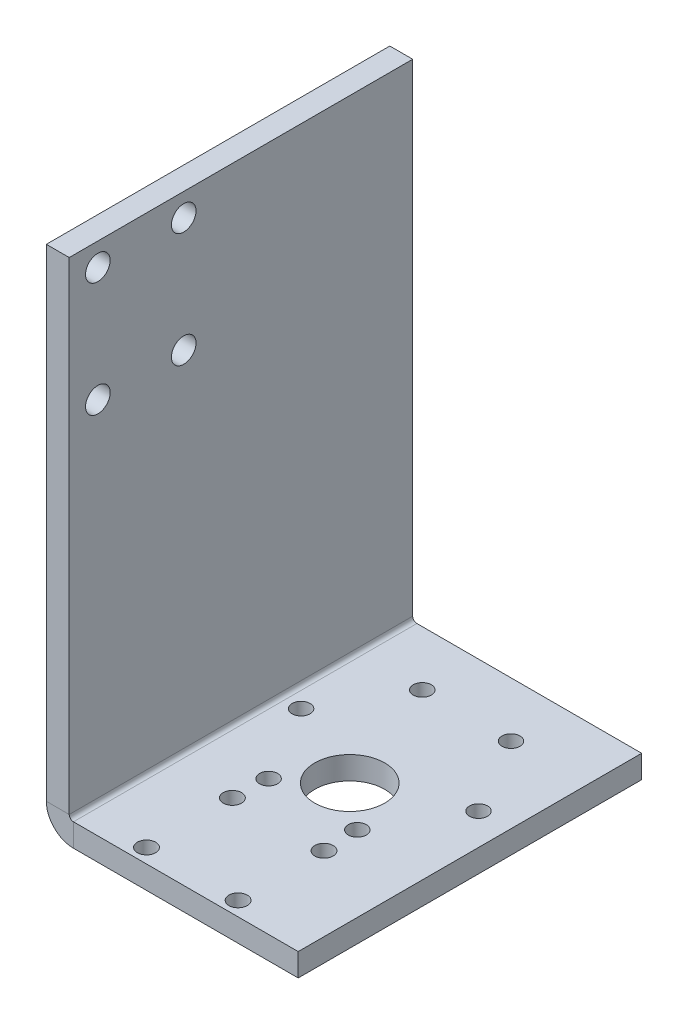
ISO-10303-21;
HEADER;
FILE_DESCRIPTION(('STEP AP214'),'2;1');
FILE_NAME('part.step','',(''),(''),'','','');
FILE_SCHEMA(('AUTOMOTIVE_DESIGN { 1 0 10303 214 1 1 1 1 }'));
ENDSEC;
DATA;
#1=APPLICATION_CONTEXT('core data for automotive mechanical design processes');
#2=APPLICATION_PROTOCOL_DEFINITION('international standard','automotive_design',2000,#1);
#3=PRODUCT_CONTEXT('',#1,'mechanical');
#4=PRODUCT('Part','Part','',(#3));
#5=PRODUCT_RELATED_PRODUCT_CATEGORY('part','',(#4));
#6=PRODUCT_DEFINITION_FORMATION('','',#4);
#7=PRODUCT_DEFINITION_CONTEXT('part definition',#1,'design');
#8=PRODUCT_DEFINITION('design','',#6,#7);
#9=PRODUCT_DEFINITION_SHAPE('','',#8);
#10=(LENGTH_UNIT() NAMED_UNIT(*) SI_UNIT(.MILLI.,.METRE.));
#11=(NAMED_UNIT(*) PLANE_ANGLE_UNIT() SI_UNIT($,.RADIAN.));
#12=(NAMED_UNIT(*) SI_UNIT($,.STERADIAN.) SOLID_ANGLE_UNIT());
#13=UNCERTAINTY_MEASURE_WITH_UNIT(LENGTH_MEASURE(1.E-05),#10,'distance_accuracy_value','');
#14=(GEOMETRIC_REPRESENTATION_CONTEXT(3) GLOBAL_UNCERTAINTY_ASSIGNED_CONTEXT((#13)) GLOBAL_UNIT_ASSIGNED_CONTEXT((#10,
#11,#12)) REPRESENTATION_CONTEXT('',''));
#15=CARTESIAN_POINT('',(0.,0.,0.));
#16=DIRECTION('',(0.,0.,1.));
#17=DIRECTION('',(1.,0.,0.));
#18=AXIS2_PLACEMENT_3D('',#15,#16,#17);
#19=CARTESIAN_POINT('',(0.7366,0.,30.));
#20=DIRECTION('',(0.,0.,1.));
#21=DIRECTION('',(1.,0.,0.));
#22=AXIS2_PLACEMENT_3D('',#19,#20,#21);
#23=PLANE('',#22);
#24=DIRECTION('',(0.,-1.,0.));
#25=VECTOR('',#24,1.);
#26=CARTESIAN_POINT('',(0.7366,0.,30.));
#27=LINE('',#26,#25);
#28=CARTESIAN_POINT('',(0.7366,0.,30.));
#29=VERTEX_POINT('',#28);
#30=CARTESIAN_POINT('',(0.7366,-4.,30.));
#31=VERTEX_POINT('',#30);
#32=EDGE_CURVE('E11',#29,#31,#27,.T.);
#33=ORIENTED_EDGE('',*,*,#32,.F.);
#34=CARTESIAN_POINT('',(0.7366,0.7366,30.));
#35=DIRECTION('',(0.,0.,-1.));
#36=DIRECTION('',(-1.,0.,0.));
#37=AXIS2_PLACEMENT_3D('',#34,#35,#36);
#38=CIRCLE('',#37,0.7366);
#39=CARTESIAN_POINT('',(0.,0.7366,30.));
#40=VERTEX_POINT('',#39);
#41=EDGE_CURVE('E138',#40,#29,#38,.F.);
#42=ORIENTED_EDGE('',*,*,#41,.F.);
#43=DIRECTION('',(1.,0.,0.));
#44=VECTOR('',#43,1.);
#45=CARTESIAN_POINT('',(-4.,0.736600000000001,30.));
#46=LINE('',#45,#44);
#47=CARTESIAN_POINT('',(-4.,0.736600000000001,30.));
#48=VERTEX_POINT('',#47);
#49=EDGE_CURVE('E48',#48,#40,#46,.T.);
#50=ORIENTED_EDGE('',*,*,#49,.F.);
#51=CARTESIAN_POINT('',(0.7366,0.7366,30.));
#52=DIRECTION('',(0.,0.,1.));
#53=DIRECTION('',(1.,0.,0.));
#54=AXIS2_PLACEMENT_3D('',#51,#52,#53);
#55=CIRCLE('',#54,4.7366);
#56=EDGE_CURVE('E131',#48,#31,#55,.T.);
#57=ORIENTED_EDGE('',*,*,#56,.T.);
#58=EDGE_LOOP('',(#33,#42,#50,#57));
#59=FACE_BOUND('',#58,.T.);
#60=ADVANCED_FACE('F39',(#59),#23,.T.);
#61=CARTESIAN_POINT('',(-4.,0.736600000000001,30.));
#62=DIRECTION('',(0.,0.,1.));
#63=DIRECTION('',(1.,0.,0.));
#64=AXIS2_PLACEMENT_3D('',#61,#62,#63);
#65=PLANE('',#64);
#66=DIRECTION('',(1.,0.,0.));
#67=VECTOR('',#66,1.);
#68=CARTESIAN_POINT('',(0.,0.,30.));
#69=LINE('',#68,#67);
#70=CARTESIAN_POINT('',(40.,0.,30.));
#71=VERTEX_POINT('',#70);
#72=EDGE_CURVE('E273',#29,#71,#69,.T.);
#73=ORIENTED_EDGE('',*,*,#72,.F.);
#74=ORIENTED_EDGE('',*,*,#32,.T.);
#75=DIRECTION('',(1.,0.,0.));
#76=VECTOR('',#75,1.);
#77=CARTESIAN_POINT('',(0.,-4.,30.));
#78=LINE('',#77,#76);
#79=CARTESIAN_POINT('',(40.,-4.,30.));
#80=VERTEX_POINT('',#79);
#81=EDGE_CURVE('E97',#31,#80,#78,.T.);
#82=ORIENTED_EDGE('',*,*,#81,.T.);
#83=DIRECTION('',(0.,-1.,0.));
#84=VECTOR('',#83,1.);
#85=CARTESIAN_POINT('',(40.,0.,30.));
#86=LINE('',#85,#84);
#87=EDGE_CURVE('E270',#71,#80,#86,.T.);
#88=ORIENTED_EDGE('',*,*,#87,.F.);
#89=EDGE_LOOP('',(#73,#74,#82,#88));
#90=FACE_BOUND('',#89,.T.);
#91=ADVANCED_FACE('F293',(#90),#65,.T.);
#92=CARTESIAN_POINT('',(0.,0.7366,-30.));
#93=DIRECTION('',(0.,0.,-1.));
#94=DIRECTION('',(-1.,0.,0.));
#95=AXIS2_PLACEMENT_3D('',#92,#93,#94);
#96=PLANE('',#95);
#97=DIRECTION('',(-1.,0.,0.));
#98=VECTOR('',#97,1.);
#99=CARTESIAN_POINT('',(0.,0.7366,-30.));
#100=LINE('',#99,#98);
#101=CARTESIAN_POINT('',(0.,0.7366,-30.));
#102=VERTEX_POINT('',#101);
#103=CARTESIAN_POINT('',(-4.,0.736600000000001,-30.));
#104=VERTEX_POINT('',#103);
#105=EDGE_CURVE('E84',#102,#104,#100,.T.);
#106=ORIENTED_EDGE('',*,*,#105,.F.);
#107=CARTESIAN_POINT('',(0.7366,0.7366,-30.));
#108=DIRECTION('',(0.,0.,-1.));
#109=DIRECTION('',(-1.,0.,0.));
#110=AXIS2_PLACEMENT_3D('',#107,#108,#109);
#111=CIRCLE('',#110,0.7366);
#112=CARTESIAN_POINT('',(0.7366,0.,-30.));
#113=VERTEX_POINT('',#112);
#114=EDGE_CURVE('E154',#102,#113,#111,.F.);
#115=ORIENTED_EDGE('',*,*,#114,.T.);
#116=DIRECTION('',(0.,1.,0.));
#117=VECTOR('',#116,1.);
#118=CARTESIAN_POINT('',(0.7366,-4.,-30.));
#119=LINE('',#118,#117);
#120=CARTESIAN_POINT('',(0.7366,-4.,-30.));
#121=VERTEX_POINT('',#120);
#122=EDGE_CURVE('E91',#121,#113,#119,.T.);
#123=ORIENTED_EDGE('',*,*,#122,.F.);
#124=CARTESIAN_POINT('',(0.7366,0.7366,-30.));
#125=DIRECTION('',(0.,0.,1.));
#126=DIRECTION('',(1.,0.,0.));
#127=AXIS2_PLACEMENT_3D('',#124,#125,#126);
#128=CIRCLE('',#127,4.7366);
#129=EDGE_CURVE('E161',#104,#121,#128,.T.);
#130=ORIENTED_EDGE('',*,*,#129,.F.);
#131=EDGE_LOOP('',(#106,#115,#123,#130));
#132=FACE_BOUND('',#131,.T.);
#133=ADVANCED_FACE('F291',(#132),#96,.T.);
#134=CARTESIAN_POINT('',(0.7366,-4.,-30.));
#135=DIRECTION('',(0.,0.,-1.));
#136=DIRECTION('',(-1.,0.,0.));
#137=AXIS2_PLACEMENT_3D('',#134,#135,#136);
#138=PLANE('',#137);
#139=DIRECTION('',(0.,-1.,0.));
#140=VECTOR('',#139,1.);
#141=CARTESIAN_POINT('',(0.,0.,-30.));
#142=LINE('',#141,#140);
#143=CARTESIAN_POINT('',(0.,85.,-30.));
#144=VERTEX_POINT('',#143);
#145=EDGE_CURVE('E156',#144,#102,#142,.T.);
#146=ORIENTED_EDGE('',*,*,#145,.T.);
#147=ORIENTED_EDGE('',*,*,#105,.T.);
#148=DIRECTION('',(0.,1.,0.));
#149=VECTOR('',#148,1.);
#150=CARTESIAN_POINT('',(-4.,0.,-30.));
#151=LINE('',#150,#149);
#152=CARTESIAN_POINT('',(-4.,85.,-30.));
#153=VERTEX_POINT('',#152);
#154=EDGE_CURVE('E159',#153,#104,#151,.F.);
#155=ORIENTED_EDGE('',*,*,#154,.F.);
#156=DIRECTION('',(1.,0.,0.));
#157=VECTOR('',#156,1.);
#158=CARTESIAN_POINT('',(-4.,85.,-30.));
#159=LINE('',#158,#157);
#160=EDGE_CURVE('E119',#153,#144,#159,.T.);
#161=ORIENTED_EDGE('',*,*,#160,.T.);
#162=EDGE_LOOP('',(#146,#147,#155,#161));
#163=FACE_BOUND('',#162,.T.);
#164=ADVANCED_FACE('F287',(#163),#138,.T.);
#165=CARTESIAN_POINT('',(0.,-4.,30.));
#166=DIRECTION('',(0.,1.,0.));
#167=DIRECTION('',(0.,0.,1.));
#168=AXIS2_PLACEMENT_3D('',#165,#166,#167);
#169=PLANE('',#168);
#170=CARTESIAN_POINT('',(34.5,-4.,-7.));
#171=DIRECTION('',(0.,-1.,0.));
#172=DIRECTION('',(0.,0.,-1.));
#173=AXIS2_PLACEMENT_3D('',#170,#171,#172);
#174=CIRCLE('',#173,1.57499999999999);
#175=CARTESIAN_POINT('',(34.5,-4.,-8.57499999999999));
#176=VERTEX_POINT('',#175);
#177=EDGE_CURVE('E209',#176,#176,#174,.T.);
#178=ORIENTED_EDGE('',*,*,#177,.F.);
#179=EDGE_LOOP('',(#178));
#180=FACE_BOUND('',#179,.T.);
#181=CARTESIAN_POINT('',(3.5,-4.,-7.));
#182=DIRECTION('',(0.,-1.,0.));
#183=DIRECTION('',(0.,0.,-1.));
#184=AXIS2_PLACEMENT_3D('',#181,#182,#183);
#185=CIRCLE('',#184,1.57499999999999);
#186=CARTESIAN_POINT('',(3.5,-4.,-8.57499999999999));
#187=VERTEX_POINT('',#186);
#188=EDGE_CURVE('E199',#187,#187,#185,.T.);
#189=ORIENTED_EDGE('',*,*,#188,.F.);
#190=EDGE_LOOP('',(#189));
#191=FACE_BOUND('',#190,.T.);
#192=CARTESIAN_POINT('',(11.25,-4.,6.42339375865881));
#193=DIRECTION('',(0.,-1.,0.));
#194=DIRECTION('',(0.,0.,-1.));
#195=AXIS2_PLACEMENT_3D('',#192,#193,#194);
#196=CIRCLE('',#195,1.57499999999999);
#197=CARTESIAN_POINT('',(11.25,-4.,4.84839375865882));
#198=VERTEX_POINT('',#197);
#199=EDGE_CURVE('E196',#198,#198,#196,.T.);
#200=ORIENTED_EDGE('',*,*,#199,.F.);
#201=EDGE_LOOP('',(#200));
#202=FACE_BOUND('',#201,.T.);
#203=CARTESIAN_POINT('',(11.2499999999999,-4.,-20.4233937586588));
#204=DIRECTION('',(0.,-1.,0.));
#205=DIRECTION('',(0.,0.,-1.));
#206=AXIS2_PLACEMENT_3D('',#203,#204,#205);
#207=CIRCLE('',#206,1.57499999999999);
#208=CARTESIAN_POINT('',(11.2499999999999,-4.,-21.9983937586588));
#209=VERTEX_POINT('',#208);
#210=EDGE_CURVE('E193',#209,#209,#207,.T.);
#211=ORIENTED_EDGE('',*,*,#210,.F.);
#212=EDGE_LOOP('',(#211));
#213=FACE_BOUND('',#212,.T.);
#214=CARTESIAN_POINT('',(26.75,-4.,-20.4233937586588));
#215=DIRECTION('',(0.,-1.,0.));
#216=DIRECTION('',(0.,0.,-1.));
#217=AXIS2_PLACEMENT_3D('',#214,#215,#216);
#218=CIRCLE('',#217,1.57499999999999);
#219=CARTESIAN_POINT('',(26.75,-4.,-21.9983937586588));
#220=VERTEX_POINT('',#219);
#221=EDGE_CURVE('E189',#220,#220,#218,.T.);
#222=ORIENTED_EDGE('',*,*,#221,.F.);
#223=EDGE_LOOP('',(#222));
#224=FACE_BOUND('',#223,.T.);
#225=CARTESIAN_POINT('',(26.7500000000001,-4.,6.42339375865876));
#226=DIRECTION('',(0.,-1.,0.));
#227=DIRECTION('',(0.,0.,-1.));
#228=AXIS2_PLACEMENT_3D('',#225,#226,#227);
#229=CIRCLE('',#228,1.57499999999999);
#230=CARTESIAN_POINT('',(26.7500000000001,-4.,4.84839375865877));
#231=VERTEX_POINT('',#230);
#232=EDGE_CURVE('E188',#231,#231,#229,.T.);
#233=ORIENTED_EDGE('',*,*,#232,.F.);
#234=EDGE_LOOP('',(#233));
#235=FACE_BOUND('',#234,.T.);
#236=CARTESIAN_POINT('',(19.,-4.,0.));
#237=DIRECTION('',(0.,-1.,0.));
#238=DIRECTION('',(0.,0.,-1.));
#239=AXIS2_PLACEMENT_3D('',#236,#237,#238);
#240=CIRCLE('',#239,6.10000000000001);
#241=CARTESIAN_POINT('',(19.,-4.,-6.10000000000001));
#242=VERTEX_POINT('',#241);
#243=EDGE_CURVE('E184',#242,#242,#240,.T.);
#244=ORIENTED_EDGE('',*,*,#243,.F.);
#245=EDGE_LOOP('',(#244));
#246=FACE_BOUND('',#245,.T.);
#247=CARTESIAN_POINT('',(27.,-4.,27.5));
#248=DIRECTION('',(0.,1.,0.));
#249=DIRECTION('',(0.,0.,1.));
#250=AXIS2_PLACEMENT_3D('',#247,#248,#249);
#251=CIRCLE('',#250,1.59999999999999);
#252=CARTESIAN_POINT('',(27.,-4.,29.1));
#253=VERTEX_POINT('',#252);
#254=EDGE_CURVE('E249',#253,#253,#251,.T.);
#255=ORIENTED_EDGE('',*,*,#254,.T.);
#256=EDGE_LOOP('',(#255));
#257=FACE_BOUND('',#256,.T.);
#258=CARTESIAN_POINT('',(11.,-4.,12.5));
#259=DIRECTION('',(0.,1.,0.));
#260=DIRECTION('',(0.,0.,1.));
#261=AXIS2_PLACEMENT_3D('',#258,#259,#260);
#262=CIRCLE('',#261,1.59999999999999);
#263=CARTESIAN_POINT('',(11.,-4.,14.1));
#264=VERTEX_POINT('',#263);
#265=EDGE_CURVE('E255',#264,#264,#262,.T.);
#266=ORIENTED_EDGE('',*,*,#265,.T.);
#267=EDGE_LOOP('',(#266));
#268=FACE_BOUND('',#267,.T.);
#269=CARTESIAN_POINT('',(11.,-4.,27.5));
#270=DIRECTION('',(0.,1.,0.));
#271=DIRECTION('',(0.,0.,1.));
#272=AXIS2_PLACEMENT_3D('',#269,#270,#271);
#273=CIRCLE('',#272,1.59999999999999);
#274=CARTESIAN_POINT('',(11.,-4.,29.1));
#275=VERTEX_POINT('',#274);
#276=EDGE_CURVE('E261',#275,#275,#273,.T.);
#277=ORIENTED_EDGE('',*,*,#276,.T.);
#278=EDGE_LOOP('',(#277));
#279=FACE_BOUND('',#278,.T.);
#280=CARTESIAN_POINT('',(27.,-4.,12.5));
#281=DIRECTION('',(0.,1.,0.));
#282=DIRECTION('',(0.,0.,1.));
#283=AXIS2_PLACEMENT_3D('',#280,#281,#282);
#284=CIRCLE('',#283,1.59999999999999);
#285=CARTESIAN_POINT('',(27.,-4.,14.1));
#286=VERTEX_POINT('',#285);
#287=EDGE_CURVE('E148',#286,#286,#284,.T.);
#288=ORIENTED_EDGE('',*,*,#287,.T.);
#289=EDGE_LOOP('',(#288));
#290=FACE_BOUND('',#289,.T.);
#291=DIRECTION('',(1.,0.,0.));
#292=VECTOR('',#291,1.);
#293=CARTESIAN_POINT('',(0.,-4.,-30.));
#294=LINE('',#293,#292);
#295=CARTESIAN_POINT('',(40.,-4.,-30.));
#296=VERTEX_POINT('',#295);
#297=EDGE_CURVE('E144',#121,#296,#294,.T.);
#298=ORIENTED_EDGE('',*,*,#297,.T.);
#299=DIRECTION('',(0.,0.,-1.));
#300=VECTOR('',#299,1.);
#301=CARTESIAN_POINT('',(40.,-4.,30.));
#302=LINE('',#301,#300);
#303=EDGE_CURVE('E175',#80,#296,#302,.T.);
#304=ORIENTED_EDGE('',*,*,#303,.F.);
#305=ORIENTED_EDGE('',*,*,#81,.F.);
#306=DIRECTION('',(0.,0.,-1.));
#307=VECTOR('',#306,1.);
#308=CARTESIAN_POINT('',(0.7366,-4.,30.));
#309=LINE('',#308,#307);
#310=EDGE_CURVE('E143',#31,#121,#309,.T.);
#311=ORIENTED_EDGE('',*,*,#310,.T.);
#312=EDGE_LOOP('',(#298,#304,#305,#311));
#313=FACE_BOUND('',#312,.T.);
#314=ADVANCED_FACE('F299',(#180,#191,#202,#213,#224,#235,#246,#257,#268,#279,#290,#313),#169,.F.);
#315=CARTESIAN_POINT('',(40.,0.,30.));
#316=DIRECTION('',(1.,0.,0.));
#317=DIRECTION('',(0.,0.,-1.));
#318=AXIS2_PLACEMENT_3D('',#315,#316,#317);
#319=PLANE('',#318);
#320=DIRECTION('',(0.,-1.,0.));
#321=VECTOR('',#320,1.);
#322=CARTESIAN_POINT('',(40.,0.,-30.));
#323=LINE('',#322,#321);
#324=CARTESIAN_POINT('',(40.,0.,-30.));
#325=VERTEX_POINT('',#324);
#326=EDGE_CURVE('E147',#325,#296,#323,.T.);
#327=ORIENTED_EDGE('',*,*,#326,.F.);
#328=DIRECTION('',(0.,0.,-1.));
#329=VECTOR('',#328,1.);
#330=CARTESIAN_POINT('',(40.,0.,30.));
#331=LINE('',#330,#329);
#332=EDGE_CURVE('E173',#71,#325,#331,.T.);
#333=ORIENTED_EDGE('',*,*,#332,.F.);
#334=ORIENTED_EDGE('',*,*,#87,.T.);
#335=ORIENTED_EDGE('',*,*,#303,.T.);
#336=EDGE_LOOP('',(#327,#333,#334,#335));
#337=FACE_BOUND('',#336,.T.);
#338=ADVANCED_FACE('F328',(#337),#319,.T.);
#339=CARTESIAN_POINT('',(0.,0.,30.));
#340=DIRECTION('',(0.,1.,0.));
#341=DIRECTION('',(0.,0.,1.));
#342=AXIS2_PLACEMENT_3D('',#339,#340,#341);
#343=PLANE('',#342);
#344=CARTESIAN_POINT('',(34.5,0.,-7.));
#345=DIRECTION('',(0.,1.,0.));
#346=DIRECTION('',(0.,0.,1.));
#347=AXIS2_PLACEMENT_3D('',#344,#345,#346);
#348=CIRCLE('',#347,1.57499999999999);
#349=CARTESIAN_POINT('',(34.5,0.,-5.42500000000001));
#350=VERTEX_POINT('',#349);
#351=EDGE_CURVE('E42',#350,#350,#348,.T.);
#352=ORIENTED_EDGE('',*,*,#351,.F.);
#353=EDGE_LOOP('',(#352));
#354=FACE_BOUND('',#353,.T.);
#355=CARTESIAN_POINT('',(3.5,0.,-7.));
#356=DIRECTION('',(0.,1.,0.));
#357=DIRECTION('',(0.,0.,1.));
#358=AXIS2_PLACEMENT_3D('',#355,#356,#357);
#359=CIRCLE('',#358,1.57499999999999);
#360=CARTESIAN_POINT('',(3.5,0.,-5.42500000000001));
#361=VERTEX_POINT('',#360);
#362=EDGE_CURVE('E197',#361,#361,#359,.T.);
#363=ORIENTED_EDGE('',*,*,#362,.F.);
#364=EDGE_LOOP('',(#363));
#365=FACE_BOUND('',#364,.T.);
#366=CARTESIAN_POINT('',(11.25,0.,6.42339375865881));
#367=DIRECTION('',(0.,1.,0.));
#368=DIRECTION('',(0.,0.,1.));
#369=AXIS2_PLACEMENT_3D('',#366,#367,#368);
#370=CIRCLE('',#369,1.57499999999999);
#371=CARTESIAN_POINT('',(11.25,0.,7.9983937586588));
#372=VERTEX_POINT('',#371);
#373=EDGE_CURVE('E194',#372,#372,#370,.T.);
#374=ORIENTED_EDGE('',*,*,#373,.F.);
#375=EDGE_LOOP('',(#374));
#376=FACE_BOUND('',#375,.T.);
#377=CARTESIAN_POINT('',(11.2499999999999,0.,-20.4233937586588));
#378=DIRECTION('',(0.,1.,0.));
#379=DIRECTION('',(0.,0.,1.));
#380=AXIS2_PLACEMENT_3D('',#377,#378,#379);
#381=CIRCLE('',#380,1.57499999999999);
#382=CARTESIAN_POINT('',(11.2499999999999,0.,-18.8483937586588));
#383=VERTEX_POINT('',#382);
#384=EDGE_CURVE('E190',#383,#383,#381,.T.);
#385=ORIENTED_EDGE('',*,*,#384,.F.);
#386=EDGE_LOOP('',(#385));
#387=FACE_BOUND('',#386,.T.);
#388=CARTESIAN_POINT('',(26.75,0.,-20.4233937586588));
#389=DIRECTION('',(0.,1.,0.));
#390=DIRECTION('',(0.,0.,1.));
#391=AXIS2_PLACEMENT_3D('',#388,#389,#390);
#392=CIRCLE('',#391,1.57499999999999);
#393=CARTESIAN_POINT('',(26.75,0.,-18.8483937586588));
#394=VERTEX_POINT('',#393);
#395=EDGE_CURVE('E185',#394,#394,#392,.T.);
#396=ORIENTED_EDGE('',*,*,#395,.F.);
#397=EDGE_LOOP('',(#396));
#398=FACE_BOUND('',#397,.T.);
#399=CARTESIAN_POINT('',(26.7500000000001,0.,6.42339375865876));
#400=DIRECTION('',(0.,1.,0.));
#401=DIRECTION('',(0.,0.,1.));
#402=AXIS2_PLACEMENT_3D('',#399,#400,#401);
#403=CIRCLE('',#402,1.57499999999999);
#404=CARTESIAN_POINT('',(26.7500000000001,0.,7.99839375865875));
#405=VERTEX_POINT('',#404);
#406=EDGE_CURVE('E218',#405,#405,#403,.T.);
#407=ORIENTED_EDGE('',*,*,#406,.F.);
#408=EDGE_LOOP('',(#407));
#409=FACE_BOUND('',#408,.T.);
#410=CARTESIAN_POINT('',(19.,0.,0.));
#411=DIRECTION('',(0.,1.,0.));
#412=DIRECTION('',(0.,0.,1.));
#413=AXIS2_PLACEMENT_3D('',#410,#411,#412);
#414=CIRCLE('',#413,6.10000000000001);
#415=CARTESIAN_POINT('',(19.,0.,6.1));
#416=VERTEX_POINT('',#415);
#417=EDGE_CURVE('E180',#416,#416,#414,.T.);
#418=ORIENTED_EDGE('',*,*,#417,.F.);
#419=EDGE_LOOP('',(#418));
#420=FACE_BOUND('',#419,.T.);
#421=CARTESIAN_POINT('',(27.,0.,27.5));
#422=DIRECTION('',(0.,1.,0.));
#423=DIRECTION('',(0.,0.,1.));
#424=AXIS2_PLACEMENT_3D('',#421,#422,#423);
#425=CIRCLE('',#424,1.59999999999999);
#426=CARTESIAN_POINT('',(27.,0.,29.1));
#427=VERTEX_POINT('',#426);
#428=EDGE_CURVE('E183',#427,#427,#425,.T.);
#429=ORIENTED_EDGE('',*,*,#428,.F.);
#430=EDGE_LOOP('',(#429));
#431=FACE_BOUND('',#430,.T.);
#432=CARTESIAN_POINT('',(11.,0.,12.5));
#433=DIRECTION('',(0.,1.,0.));
#434=DIRECTION('',(0.,0.,1.));
#435=AXIS2_PLACEMENT_3D('',#432,#433,#434);
#436=CIRCLE('',#435,1.59999999999999);
#437=CARTESIAN_POINT('',(11.,0.,14.1));
#438=VERTEX_POINT('',#437);
#439=EDGE_CURVE('E252',#438,#438,#436,.T.);
#440=ORIENTED_EDGE('',*,*,#439,.F.);
#441=EDGE_LOOP('',(#440));
#442=FACE_BOUND('',#441,.T.);
#443=CARTESIAN_POINT('',(11.,0.,27.5));
#444=DIRECTION('',(0.,1.,0.));
#445=DIRECTION('',(0.,0.,1.));
#446=AXIS2_PLACEMENT_3D('',#443,#444,#445);
#447=CIRCLE('',#446,1.59999999999999);
#448=CARTESIAN_POINT('',(11.,0.,29.1));
#449=VERTEX_POINT('',#448);
#450=EDGE_CURVE('E258',#449,#449,#447,.T.);
#451=ORIENTED_EDGE('',*,*,#450,.F.);
#452=EDGE_LOOP('',(#451));
#453=FACE_BOUND('',#452,.T.);
#454=CARTESIAN_POINT('',(27.,0.,12.5));
#455=DIRECTION('',(0.,1.,0.));
#456=DIRECTION('',(0.,0.,1.));
#457=AXIS2_PLACEMENT_3D('',#454,#455,#456);
#458=CIRCLE('',#457,1.59999999999999);
#459=CARTESIAN_POINT('',(27.,0.,14.1));
#460=VERTEX_POINT('',#459);
#461=EDGE_CURVE('E264',#460,#460,#458,.T.);
#462=ORIENTED_EDGE('',*,*,#461,.F.);
#463=EDGE_LOOP('',(#462));
#464=FACE_BOUND('',#463,.T.);
#465=DIRECTION('',(1.,0.,0.));
#466=VECTOR('',#465,1.);
#467=CARTESIAN_POINT('',(0.,0.,-30.));
#468=LINE('',#467,#466);
#469=EDGE_CURVE('E151',#113,#325,#468,.T.);
#470=ORIENTED_EDGE('',*,*,#469,.F.);
#471=DIRECTION('',(0.,0.,-1.));
#472=VECTOR('',#471,1.);
#473=CARTESIAN_POINT('',(0.7366,0.,30.));
#474=LINE('',#473,#472);
#475=EDGE_CURVE('E170',#29,#113,#474,.T.);
#476=ORIENTED_EDGE('',*,*,#475,.F.);
#477=ORIENTED_EDGE('',*,*,#72,.T.);
#478=ORIENTED_EDGE('',*,*,#332,.T.);
#479=EDGE_LOOP('',(#470,#476,#477,#478));
#480=FACE_BOUND('',#479,.T.);
#481=ADVANCED_FACE('F333',(#354,#365,#376,#387,#398,#409,#420,#431,#442,#453,#464,#480),#343,.T.);
#482=CARTESIAN_POINT('',(0.7366,0.7366,30.));
#483=DIRECTION('',(0.,0.,-1.));
#484=DIRECTION('',(-1.,0.,0.));
#485=AXIS2_PLACEMENT_3D('',#482,#483,#484);
#486=CYLINDRICAL_SURFACE('',#485,0.7366);
#487=ORIENTED_EDGE('',*,*,#114,.F.);
#488=DIRECTION('',(0.,0.,-1.));
#489=VECTOR('',#488,1.);
#490=CARTESIAN_POINT('',(0.,0.7366,30.));
#491=LINE('',#490,#489);
#492=EDGE_CURVE('E167',#40,#102,#491,.T.);
#493=ORIENTED_EDGE('',*,*,#492,.F.);
#494=ORIENTED_EDGE('',*,*,#41,.T.);
#495=ORIENTED_EDGE('',*,*,#475,.T.);
#496=EDGE_LOOP('',(#487,#493,#494,#495));
#497=FACE_BOUND('',#496,.T.);
#498=ADVANCED_FACE('F280',(#497),#486,.F.);
#499=CARTESIAN_POINT('',(0.,0.,30.));
#500=DIRECTION('',(1.,0.,0.));
#501=DIRECTION('',(0.,0.,-1.));
#502=AXIS2_PLACEMENT_3D('',#499,#500,#501);
#503=PLANE('',#502);
#504=CARTESIAN_POINT('',(0.,81.,25.));
#505=DIRECTION('',(1.,0.,0.));
#506=DIRECTION('',(0.,0.,-1.));
#507=AXIS2_PLACEMENT_3D('',#504,#505,#506);
#508=CIRCLE('',#507,2.15);
#509=CARTESIAN_POINT('',(0.,81.,22.85));
#510=VERTEX_POINT('',#509);
#511=EDGE_CURVE('E221',#510,#510,#508,.T.);
#512=ORIENTED_EDGE('',*,*,#511,.F.);
#513=EDGE_LOOP('',(#512));
#514=FACE_BOUND('',#513,.T.);
#515=CARTESIAN_POINT('',(0.,61.,25.));
#516=DIRECTION('',(1.,0.,0.));
#517=DIRECTION('',(0.,0.,-1.));
#518=AXIS2_PLACEMENT_3D('',#515,#516,#517);
#519=CIRCLE('',#518,2.14999999999999);
#520=CARTESIAN_POINT('',(0.,61.,22.85));
#521=VERTEX_POINT('',#520);
#522=EDGE_CURVE('E227',#521,#521,#519,.T.);
#523=ORIENTED_EDGE('',*,*,#522,.F.);
#524=EDGE_LOOP('',(#523));
#525=FACE_BOUND('',#524,.T.);
#526=CARTESIAN_POINT('',(0.,61.,10.));
#527=DIRECTION('',(1.,0.,0.));
#528=DIRECTION('',(0.,0.,-1.));
#529=AXIS2_PLACEMENT_3D('',#526,#527,#528);
#530=CIRCLE('',#529,2.14999999999999);
#531=CARTESIAN_POINT('',(0.,61.,7.85000000000001));
#532=VERTEX_POINT('',#531);
#533=EDGE_CURVE('E233',#532,#532,#530,.T.);
#534=ORIENTED_EDGE('',*,*,#533,.F.);
#535=EDGE_LOOP('',(#534));
#536=FACE_BOUND('',#535,.T.);
#537=CARTESIAN_POINT('',(0.,81.,10.));
#538=DIRECTION('',(1.,0.,0.));
#539=DIRECTION('',(0.,0.,-1.));
#540=AXIS2_PLACEMENT_3D('',#537,#538,#539);
#541=CIRCLE('',#540,2.15);
#542=CARTESIAN_POINT('',(0.,81.,7.85));
#543=VERTEX_POINT('',#542);
#544=EDGE_CURVE('E239',#543,#543,#541,.T.);
#545=ORIENTED_EDGE('',*,*,#544,.F.);
#546=EDGE_LOOP('',(#545));
#547=FACE_BOUND('',#546,.T.);
#548=ORIENTED_EDGE('',*,*,#145,.F.);
#549=DIRECTION('',(0.,0.,-1.));
#550=VECTOR('',#549,1.);
#551=CARTESIAN_POINT('',(0.,85.,30.));
#552=LINE('',#551,#550);
#553=CARTESIAN_POINT('',(0.,85.,30.));
#554=VERTEX_POINT('',#553);
#555=EDGE_CURVE('E121',#554,#144,#552,.T.);
#556=ORIENTED_EDGE('',*,*,#555,.F.);
#557=DIRECTION('',(0.,-1.,0.));
#558=VECTOR('',#557,1.);
#559=CARTESIAN_POINT('',(0.,0.,30.));
#560=LINE('',#559,#558);
#561=EDGE_CURVE('E136',#554,#40,#560,.T.);
#562=ORIENTED_EDGE('',*,*,#561,.T.);
#563=ORIENTED_EDGE('',*,*,#492,.T.);
#564=EDGE_LOOP('',(#548,#556,#562,#563));
#565=FACE_BOUND('',#564,.T.);
#566=ADVANCED_FACE('F286',(#514,#525,#536,#547,#565),#503,.T.);
#567=CARTESIAN_POINT('',(-4.,85.,30.));
#568=DIRECTION('',(0.,1.,0.));
#569=DIRECTION('',(0.,0.,1.));
#570=AXIS2_PLACEMENT_3D('',#567,#568,#569);
#571=PLANE('',#570);
#572=ORIENTED_EDGE('',*,*,#160,.F.);
#573=DIRECTION('',(0.,0.,-1.));
#574=VECTOR('',#573,1.);
#575=CARTESIAN_POINT('',(-4.,85.,30.));
#576=LINE('',#575,#574);
#577=CARTESIAN_POINT('',(-4.,85.,30.));
#578=VERTEX_POINT('',#577);
#579=EDGE_CURVE('E113',#578,#153,#576,.T.);
#580=ORIENTED_EDGE('',*,*,#579,.F.);
#581=DIRECTION('',(1.,0.,0.));
#582=VECTOR('',#581,1.);
#583=CARTESIAN_POINT('',(-4.,85.,30.));
#584=LINE('',#583,#582);
#585=EDGE_CURVE('E117',#578,#554,#584,.T.);
#586=ORIENTED_EDGE('',*,*,#585,.T.);
#587=ORIENTED_EDGE('',*,*,#555,.T.);
#588=EDGE_LOOP('',(#572,#580,#586,#587));
#589=FACE_BOUND('',#588,.T.);
#590=ADVANCED_FACE('F115',(#589),#571,.T.);
#591=CARTESIAN_POINT('',(-4.,0.,30.));
#592=DIRECTION('',(1.,0.,0.));
#593=DIRECTION('',(0.,0.,-1.));
#594=AXIS2_PLACEMENT_3D('',#591,#592,#593);
#595=PLANE('',#594);
#596=CARTESIAN_POINT('',(-4.,81.,25.));
#597=DIRECTION('',(1.,0.,0.));
#598=DIRECTION('',(0.,0.,-1.));
#599=AXIS2_PLACEMENT_3D('',#596,#597,#598);
#600=CIRCLE('',#599,2.15);
#601=CARTESIAN_POINT('',(-4.,81.,22.85));
#602=VERTEX_POINT('',#601);
#603=EDGE_CURVE('E224',#602,#602,#600,.T.);
#604=ORIENTED_EDGE('',*,*,#603,.T.);
#605=EDGE_LOOP('',(#604));
#606=FACE_BOUND('',#605,.T.);
#607=CARTESIAN_POINT('',(-4.,61.,25.));
#608=DIRECTION('',(1.,0.,0.));
#609=DIRECTION('',(0.,0.,-1.));
#610=AXIS2_PLACEMENT_3D('',#607,#608,#609);
#611=CIRCLE('',#610,2.14999999999999);
#612=CARTESIAN_POINT('',(-4.,61.,22.85));
#613=VERTEX_POINT('',#612);
#614=EDGE_CURVE('E230',#613,#613,#611,.T.);
#615=ORIENTED_EDGE('',*,*,#614,.T.);
#616=EDGE_LOOP('',(#615));
#617=FACE_BOUND('',#616,.T.);
#618=CARTESIAN_POINT('',(-4.,61.,10.));
#619=DIRECTION('',(1.,0.,0.));
#620=DIRECTION('',(0.,0.,-1.));
#621=AXIS2_PLACEMENT_3D('',#618,#619,#620);
#622=CIRCLE('',#621,2.14999999999999);
#623=CARTESIAN_POINT('',(-4.,61.,7.85000000000001));
#624=VERTEX_POINT('',#623);
#625=EDGE_CURVE('E236',#624,#624,#622,.T.);
#626=ORIENTED_EDGE('',*,*,#625,.T.);
#627=EDGE_LOOP('',(#626));
#628=FACE_BOUND('',#627,.T.);
#629=CARTESIAN_POINT('',(-4.,81.,10.));
#630=DIRECTION('',(1.,0.,0.));
#631=DIRECTION('',(0.,0.,-1.));
#632=AXIS2_PLACEMENT_3D('',#629,#630,#631);
#633=CIRCLE('',#632,2.15);
#634=CARTESIAN_POINT('',(-4.,81.,7.85));
#635=VERTEX_POINT('',#634);
#636=EDGE_CURVE('E242',#635,#635,#633,.T.);
#637=ORIENTED_EDGE('',*,*,#636,.T.);
#638=EDGE_LOOP('',(#637));
#639=FACE_BOUND('',#638,.T.);
#640=ORIENTED_EDGE('',*,*,#154,.T.);
#641=DIRECTION('',(0.,0.,-1.));
#642=VECTOR('',#641,1.);
#643=CARTESIAN_POINT('',(-4.,0.736600000000001,30.));
#644=LINE('',#643,#642);
#645=EDGE_CURVE('E122',#48,#104,#644,.T.);
#646=ORIENTED_EDGE('',*,*,#645,.F.);
#647=DIRECTION('',(0.,1.,0.));
#648=VECTOR('',#647,1.);
#649=CARTESIAN_POINT('',(-4.,0.,30.));
#650=LINE('',#649,#648);
#651=EDGE_CURVE('E126',#578,#48,#650,.F.);
#652=ORIENTED_EDGE('',*,*,#651,.F.);
#653=ORIENTED_EDGE('',*,*,#579,.T.);
#654=EDGE_LOOP('',(#640,#646,#652,#653));
#655=FACE_BOUND('',#654,.T.);
#656=ADVANCED_FACE('F127',(#606,#617,#628,#639,#655),#595,.F.);
#657=CARTESIAN_POINT('',(0.7366,0.7366,30.));
#658=DIRECTION('',(0.,0.,-1.));
#659=DIRECTION('',(-1.,0.,0.));
#660=AXIS2_PLACEMENT_3D('',#657,#658,#659);
#661=CYLINDRICAL_SURFACE('',#660,4.7366);
#662=ORIENTED_EDGE('',*,*,#129,.T.);
#663=ORIENTED_EDGE('',*,*,#310,.F.);
#664=ORIENTED_EDGE('',*,*,#56,.F.);
#665=ORIENTED_EDGE('',*,*,#645,.T.);
#666=EDGE_LOOP('',(#662,#663,#664,#665));
#667=FACE_BOUND('',#666,.T.);
#668=ADVANCED_FACE('F289',(#667),#661,.T.);
#669=CARTESIAN_POINT('',(0.7366,0.7366,30.));
#670=DIRECTION('',(0.,0.,-1.));
#671=DIRECTION('',(-1.,0.,0.));
#672=AXIS2_PLACEMENT_3D('',#669,#670,#671);
#673=PLANE('',#672);
#674=ORIENTED_EDGE('',*,*,#651,.T.);
#675=ORIENTED_EDGE('',*,*,#49,.T.);
#676=ORIENTED_EDGE('',*,*,#561,.F.);
#677=ORIENTED_EDGE('',*,*,#585,.F.);
#678=EDGE_LOOP('',(#674,#675,#676,#677));
#679=FACE_BOUND('',#678,.T.);
#680=ADVANCED_FACE('F134',(#679),#673,.F.);
#681=CARTESIAN_POINT('',(0.7366,0.7366,-30.));
#682=DIRECTION('',(0.,0.,-1.));
#683=DIRECTION('',(-1.,0.,0.));
#684=AXIS2_PLACEMENT_3D('',#681,#682,#683);
#685=PLANE('',#684);
#686=ORIENTED_EDGE('',*,*,#297,.F.);
#687=ORIENTED_EDGE('',*,*,#122,.T.);
#688=ORIENTED_EDGE('',*,*,#469,.T.);
#689=ORIENTED_EDGE('',*,*,#326,.T.);
#690=EDGE_LOOP('',(#686,#687,#688,#689));
#691=FACE_BOUND('',#690,.T.);
#692=ADVANCED_FACE('F377',(#691),#685,.T.);
#693=CARTESIAN_POINT('',(27.,0.,12.5));
#694=DIRECTION('',(0.,1.,0.));
#695=DIRECTION('',(0.,0.,1.));
#696=AXIS2_PLACEMENT_3D('',#693,#694,#695);
#697=CYLINDRICAL_SURFACE('',#696,1.59999999999999);
#698=ORIENTED_EDGE('',*,*,#287,.F.);
#699=EDGE_LOOP('',(#698));
#700=FACE_BOUND('',#699,.T.);
#701=ORIENTED_EDGE('',*,*,#461,.T.);
#702=EDGE_LOOP('',(#701));
#703=FACE_BOUND('',#702,.T.);
#704=ADVANCED_FACE('F387',(#700,#703),#697,.F.);
#705=CARTESIAN_POINT('',(11.,0.,27.5));
#706=DIRECTION('',(0.,1.,0.));
#707=DIRECTION('',(0.,0.,1.));
#708=AXIS2_PLACEMENT_3D('',#705,#706,#707);
#709=CYLINDRICAL_SURFACE('',#708,1.59999999999999);
#710=ORIENTED_EDGE('',*,*,#276,.F.);
#711=EDGE_LOOP('',(#710));
#712=FACE_BOUND('',#711,.T.);
#713=ORIENTED_EDGE('',*,*,#450,.T.);
#714=EDGE_LOOP('',(#713));
#715=FACE_BOUND('',#714,.T.);
#716=ADVANCED_FACE('F398',(#712,#715),#709,.F.);
#717=CARTESIAN_POINT('',(11.,0.,12.5));
#718=DIRECTION('',(0.,1.,0.));
#719=DIRECTION('',(0.,0.,1.));
#720=AXIS2_PLACEMENT_3D('',#717,#718,#719);
#721=CYLINDRICAL_SURFACE('',#720,1.59999999999999);
#722=ORIENTED_EDGE('',*,*,#265,.F.);
#723=EDGE_LOOP('',(#722));
#724=FACE_BOUND('',#723,.T.);
#725=ORIENTED_EDGE('',*,*,#439,.T.);
#726=EDGE_LOOP('',(#725));
#727=FACE_BOUND('',#726,.T.);
#728=ADVANCED_FACE('F408',(#724,#727),#721,.F.);
#729=CARTESIAN_POINT('',(27.,0.,27.5));
#730=DIRECTION('',(0.,1.,0.));
#731=DIRECTION('',(0.,0.,1.));
#732=AXIS2_PLACEMENT_3D('',#729,#730,#731);
#733=CYLINDRICAL_SURFACE('',#732,1.59999999999999);
#734=ORIENTED_EDGE('',*,*,#254,.F.);
#735=EDGE_LOOP('',(#734));
#736=FACE_BOUND('',#735,.T.);
#737=ORIENTED_EDGE('',*,*,#428,.T.);
#738=EDGE_LOOP('',(#737));
#739=FACE_BOUND('',#738,.T.);
#740=ADVANCED_FACE('F418',(#736,#739),#733,.F.);
#741=CARTESIAN_POINT('',(19.,85.,0.));
#742=DIRECTION('',(0.,-1.,0.));
#743=DIRECTION('',(0.,0.,-1.));
#744=AXIS2_PLACEMENT_3D('',#741,#742,#743);
#745=CYLINDRICAL_SURFACE('',#744,6.10000000000001);
#746=ORIENTED_EDGE('',*,*,#243,.T.);
#747=EDGE_LOOP('',(#746));
#748=FACE_BOUND('',#747,.T.);
#749=ORIENTED_EDGE('',*,*,#417,.T.);
#750=EDGE_LOOP('',(#749));
#751=FACE_BOUND('',#750,.T.);
#752=ADVANCED_FACE('F428',(#748,#751),#745,.F.);
#753=CARTESIAN_POINT('',(0.,81.,10.));
#754=DIRECTION('',(1.,0.,0.));
#755=DIRECTION('',(0.,0.,-1.));
#756=AXIS2_PLACEMENT_3D('',#753,#754,#755);
#757=CYLINDRICAL_SURFACE('',#756,2.15);
#758=ORIENTED_EDGE('',*,*,#636,.F.);
#759=EDGE_LOOP('',(#758));
#760=FACE_BOUND('',#759,.T.);
#761=ORIENTED_EDGE('',*,*,#544,.T.);
#762=EDGE_LOOP('',(#761));
#763=FACE_BOUND('',#762,.T.);
#764=ADVANCED_FACE('F452',(#760,#763),#757,.F.);
#765=CARTESIAN_POINT('',(0.,61.,10.));
#766=DIRECTION('',(1.,0.,0.));
#767=DIRECTION('',(0.,0.,-1.));
#768=AXIS2_PLACEMENT_3D('',#765,#766,#767);
#769=CYLINDRICAL_SURFACE('',#768,2.14999999999999);
#770=ORIENTED_EDGE('',*,*,#625,.F.);
#771=EDGE_LOOP('',(#770));
#772=FACE_BOUND('',#771,.T.);
#773=ORIENTED_EDGE('',*,*,#533,.T.);
#774=EDGE_LOOP('',(#773));
#775=FACE_BOUND('',#774,.T.);
#776=ADVANCED_FACE('F457',(#772,#775),#769,.F.);
#777=CARTESIAN_POINT('',(0.,61.,25.));
#778=DIRECTION('',(1.,0.,0.));
#779=DIRECTION('',(0.,0.,-1.));
#780=AXIS2_PLACEMENT_3D('',#777,#778,#779);
#781=CYLINDRICAL_SURFACE('',#780,2.14999999999999);
#782=ORIENTED_EDGE('',*,*,#614,.F.);
#783=EDGE_LOOP('',(#782));
#784=FACE_BOUND('',#783,.T.);
#785=ORIENTED_EDGE('',*,*,#522,.T.);
#786=EDGE_LOOP('',(#785));
#787=FACE_BOUND('',#786,.T.);
#788=ADVANCED_FACE('F467',(#784,#787),#781,.F.);
#789=CARTESIAN_POINT('',(0.,81.,25.));
#790=DIRECTION('',(1.,0.,0.));
#791=DIRECTION('',(0.,0.,-1.));
#792=AXIS2_PLACEMENT_3D('',#789,#790,#791);
#793=CYLINDRICAL_SURFACE('',#792,2.15);
#794=ORIENTED_EDGE('',*,*,#603,.F.);
#795=EDGE_LOOP('',(#794));
#796=FACE_BOUND('',#795,.T.);
#797=ORIENTED_EDGE('',*,*,#511,.T.);
#798=EDGE_LOOP('',(#797));
#799=FACE_BOUND('',#798,.T.);
#800=ADVANCED_FACE('F477',(#796,#799),#793,.F.);
#801=CARTESIAN_POINT('',(26.7500000000001,-4.,6.42339375865876));
#802=DIRECTION('',(0.,-1.,0.));
#803=DIRECTION('',(0.,0.,-1.));
#804=AXIS2_PLACEMENT_3D('',#801,#802,#803);
#805=CYLINDRICAL_SURFACE('',#804,1.57499999999999);
#806=ORIENTED_EDGE('',*,*,#406,.T.);
#807=EDGE_LOOP('',(#806));
#808=FACE_BOUND('',#807,.T.);
#809=ORIENTED_EDGE('',*,*,#232,.T.);
#810=EDGE_LOOP('',(#809));
#811=FACE_BOUND('',#810,.T.);
#812=ADVANCED_FACE('F487',(#808,#811),#805,.F.);
#813=CARTESIAN_POINT('',(26.75,-4.,-20.4233937586588));
#814=DIRECTION('',(0.,-1.,0.));
#815=DIRECTION('',(0.,0.,-1.));
#816=AXIS2_PLACEMENT_3D('',#813,#814,#815);
#817=CYLINDRICAL_SURFACE('',#816,1.57499999999999);
#818=ORIENTED_EDGE('',*,*,#395,.T.);
#819=EDGE_LOOP('',(#818));
#820=FACE_BOUND('',#819,.T.);
#821=ORIENTED_EDGE('',*,*,#221,.T.);
#822=EDGE_LOOP('',(#821));
#823=FACE_BOUND('',#822,.T.);
#824=ADVANCED_FACE('F521',(#820,#823),#817,.F.);
#825=CARTESIAN_POINT('',(11.2499999999999,-4.,-20.4233937586588));
#826=DIRECTION('',(0.,-1.,0.));
#827=DIRECTION('',(0.,0.,-1.));
#828=AXIS2_PLACEMENT_3D('',#825,#826,#827);
#829=CYLINDRICAL_SURFACE('',#828,1.57499999999999);
#830=ORIENTED_EDGE('',*,*,#384,.T.);
#831=EDGE_LOOP('',(#830));
#832=FACE_BOUND('',#831,.T.);
#833=ORIENTED_EDGE('',*,*,#210,.T.);
#834=EDGE_LOOP('',(#833));
#835=FACE_BOUND('',#834,.T.);
#836=ADVANCED_FACE('F531',(#832,#835),#829,.F.);
#837=CARTESIAN_POINT('',(11.25,-4.,6.42339375865881));
#838=DIRECTION('',(0.,-1.,0.));
#839=DIRECTION('',(0.,0.,-1.));
#840=AXIS2_PLACEMENT_3D('',#837,#838,#839);
#841=CYLINDRICAL_SURFACE('',#840,1.57499999999999);
#842=ORIENTED_EDGE('',*,*,#373,.T.);
#843=EDGE_LOOP('',(#842));
#844=FACE_BOUND('',#843,.T.);
#845=ORIENTED_EDGE('',*,*,#199,.T.);
#846=EDGE_LOOP('',(#845));
#847=FACE_BOUND('',#846,.T.);
#848=ADVANCED_FACE('F541',(#844,#847),#841,.F.);
#849=CARTESIAN_POINT('',(3.5,-4.,-7.));
#850=DIRECTION('',(0.,-1.,0.));
#851=DIRECTION('',(0.,0.,-1.));
#852=AXIS2_PLACEMENT_3D('',#849,#850,#851);
#853=CYLINDRICAL_SURFACE('',#852,1.57499999999999);
#854=ORIENTED_EDGE('',*,*,#362,.T.);
#855=EDGE_LOOP('',(#854));
#856=FACE_BOUND('',#855,.T.);
#857=ORIENTED_EDGE('',*,*,#188,.T.);
#858=EDGE_LOOP('',(#857));
#859=FACE_BOUND('',#858,.T.);
#860=ADVANCED_FACE('F551',(#856,#859),#853,.F.);
#861=CARTESIAN_POINT('',(34.5,-4.,-7.));
#862=DIRECTION('',(0.,-1.,0.));
#863=DIRECTION('',(0.,0.,-1.));
#864=AXIS2_PLACEMENT_3D('',#861,#862,#863);
#865=CYLINDRICAL_SURFACE('',#864,1.57499999999999);
#866=ORIENTED_EDGE('',*,*,#351,.T.);
#867=EDGE_LOOP('',(#866));
#868=FACE_BOUND('',#867,.T.);
#869=ORIENTED_EDGE('',*,*,#177,.T.);
#870=EDGE_LOOP('',(#869));
#871=FACE_BOUND('',#870,.T.);
#872=ADVANCED_FACE('F561',(#868,#871),#865,.F.);
#873=CLOSED_SHELL('',(#60,#91,#133,#164,#314,#338,#481,#498,#566,#590,#656,#668,#680,#692,#704,
#716,#728,#740,#752,#764,#776,#788,#800,#812,#824,#836,#848,#860,#872));
#874=MANIFOLD_SOLID_BREP('B2',#873);
#875=ADVANCED_BREP_SHAPE_REPRESENTATION('',(#18,#874),#14);
#876=SHAPE_DEFINITION_REPRESENTATION(#9,#875);
ENDSEC;
END-ISO-10303-21;
